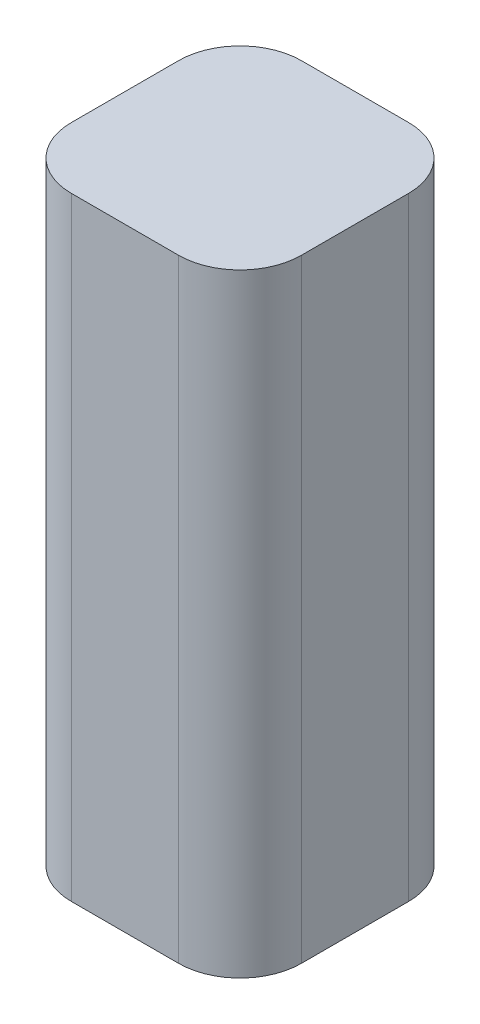
ISO-10303-21;
HEADER;
FILE_DESCRIPTION(('STEP AP214'),'2;1');
FILE_NAME('part.step','',(''),(''),'','','');
FILE_SCHEMA(('AUTOMOTIVE_DESIGN { 1 0 10303 214 1 1 1 1 }'));
ENDSEC;
DATA;
#1=APPLICATION_CONTEXT('core data for automotive mechanical design processes');
#2=APPLICATION_PROTOCOL_DEFINITION('international standard','automotive_design',2000,#1);
#3=PRODUCT_CONTEXT('',#1,'mechanical');
#4=PRODUCT('Part','Part','',(#3));
#5=PRODUCT_RELATED_PRODUCT_CATEGORY('part','',(#4));
#6=PRODUCT_DEFINITION_FORMATION('','',#4);
#7=PRODUCT_DEFINITION_CONTEXT('part definition',#1,'design');
#8=PRODUCT_DEFINITION('design','',#6,#7);
#9=PRODUCT_DEFINITION_SHAPE('','',#8);
#10=(LENGTH_UNIT() NAMED_UNIT(*) SI_UNIT(.MILLI.,.METRE.));
#11=(NAMED_UNIT(*) PLANE_ANGLE_UNIT() SI_UNIT($,.RADIAN.));
#12=(NAMED_UNIT(*) SI_UNIT($,.STERADIAN.) SOLID_ANGLE_UNIT());
#13=UNCERTAINTY_MEASURE_WITH_UNIT(LENGTH_MEASURE(1.E-05),#10,'distance_accuracy_value','');
#14=(GEOMETRIC_REPRESENTATION_CONTEXT(3) GLOBAL_UNCERTAINTY_ASSIGNED_CONTEXT((#13)) GLOBAL_UNIT_ASSIGNED_CONTEXT((#10,
#11,#12)) REPRESENTATION_CONTEXT('',''));
#15=CARTESIAN_POINT('',(0.,0.,0.));
#16=DIRECTION('',(0.,0.,1.));
#17=DIRECTION('',(1.,0.,0.));
#18=AXIS2_PLACEMENT_3D('',#15,#16,#17);
#19=CARTESIAN_POINT('',(-1.75,10.,1.75));
#20=DIRECTION('',(0.,-1.,0.));
#21=DIRECTION('',(0.,0.,-1.));
#22=AXIS2_PLACEMENT_3D('',#19,#20,#21);
#23=CYLINDRICAL_SURFACE('',#22,2.);
#24=CARTESIAN_POINT('',(-1.75,-10.,1.75));
#25=DIRECTION('',(0.,1.,0.));
#26=DIRECTION('',(0.,0.,-1.));
#27=AXIS2_PLACEMENT_3D('',#24,#25,#26);
#28=CIRCLE('',#27,2.);
#29=CARTESIAN_POINT('',(-3.75,-10.,1.75));
#30=VERTEX_POINT('',#29);
#31=CARTESIAN_POINT('',(-1.75,-10.,3.75));
#32=VERTEX_POINT('',#31);
#33=EDGE_CURVE('E146',#30,#32,#28,.T.);
#34=ORIENTED_EDGE('',*,*,#33,.T.);
#35=DIRECTION('',(0.,-1.,0.));
#36=VECTOR('',#35,1.);
#37=CARTESIAN_POINT('',(-1.75,10.,3.75));
#38=LINE('',#37,#36);
#39=CARTESIAN_POINT('',(-1.75,10.,3.75));
#40=VERTEX_POINT('',#39);
#41=EDGE_CURVE('E11',#40,#32,#38,.T.);
#42=ORIENTED_EDGE('',*,*,#41,.F.);
#43=CARTESIAN_POINT('',(-1.75,10.,1.75));
#44=DIRECTION('',(0.,1.,0.));
#45=DIRECTION('',(0.,0.,-1.));
#46=AXIS2_PLACEMENT_3D('',#43,#44,#45);
#47=CIRCLE('',#46,2.);
#48=CARTESIAN_POINT('',(-3.75,10.,1.75));
#49=VERTEX_POINT('',#48);
#50=EDGE_CURVE('E168',#49,#40,#47,.T.);
#51=ORIENTED_EDGE('',*,*,#50,.F.);
#52=DIRECTION('',(0.,-1.,0.));
#53=VECTOR('',#52,1.);
#54=CARTESIAN_POINT('',(-3.75,10.,1.75));
#55=LINE('',#54,#53);
#56=EDGE_CURVE('E142',#49,#30,#55,.T.);
#57=ORIENTED_EDGE('',*,*,#56,.T.);
#58=EDGE_LOOP('',(#34,#42,#51,#57));
#59=FACE_BOUND('',#58,.T.);
#60=ADVANCED_FACE('F45',(#59),#23,.T.);
#61=CARTESIAN_POINT('',(1.75,10.,3.75));
#62=DIRECTION('',(0.,0.,-1.));
#63=DIRECTION('',(-1.,0.,0.));
#64=AXIS2_PLACEMENT_3D('',#61,#62,#63);
#65=PLANE('',#64);
#66=DIRECTION('',(1.,0.,0.));
#67=VECTOR('',#66,1.);
#68=CARTESIAN_POINT('',(1.75,-10.,3.75));
#69=LINE('',#68,#67);
#70=CARTESIAN_POINT('',(1.75,-10.,3.75));
#71=VERTEX_POINT('',#70);
#72=EDGE_CURVE('E150',#32,#71,#69,.T.);
#73=ORIENTED_EDGE('',*,*,#72,.T.);
#74=DIRECTION('',(0.,-1.,0.));
#75=VECTOR('',#74,1.);
#76=CARTESIAN_POINT('',(1.75,10.,3.75));
#77=LINE('',#76,#75);
#78=CARTESIAN_POINT('',(1.75,10.,3.75));
#79=VERTEX_POINT('',#78);
#80=EDGE_CURVE('E54',#79,#71,#77,.T.);
#81=ORIENTED_EDGE('',*,*,#80,.F.);
#82=DIRECTION('',(1.,0.,0.));
#83=VECTOR('',#82,1.);
#84=CARTESIAN_POINT('',(1.75,10.,3.75));
#85=LINE('',#84,#83);
#86=EDGE_CURVE('E105',#40,#79,#85,.T.);
#87=ORIENTED_EDGE('',*,*,#86,.F.);
#88=ORIENTED_EDGE('',*,*,#41,.T.);
#89=EDGE_LOOP('',(#73,#81,#87,#88));
#90=FACE_BOUND('',#89,.T.);
#91=ADVANCED_FACE('F214',(#90),#65,.F.);
#92=CARTESIAN_POINT('',(1.75,10.,1.75));
#93=DIRECTION('',(0.,-1.,0.));
#94=DIRECTION('',(0.,0.,-1.));
#95=AXIS2_PLACEMENT_3D('',#92,#93,#94);
#96=CYLINDRICAL_SURFACE('',#95,2.);
#97=CARTESIAN_POINT('',(1.75,-10.,1.75));
#98=DIRECTION('',(0.,1.,0.));
#99=DIRECTION('',(0.,0.,-1.));
#100=AXIS2_PLACEMENT_3D('',#97,#98,#99);
#101=CIRCLE('',#100,2.);
#102=CARTESIAN_POINT('',(3.75,-10.,1.75));
#103=VERTEX_POINT('',#102);
#104=EDGE_CURVE('E153',#71,#103,#101,.T.);
#105=ORIENTED_EDGE('',*,*,#104,.T.);
#106=DIRECTION('',(0.,-1.,0.));
#107=VECTOR('',#106,1.);
#108=CARTESIAN_POINT('',(3.75,10.,1.75));
#109=LINE('',#108,#107);
#110=CARTESIAN_POINT('',(3.75,10.,1.75));
#111=VERTEX_POINT('',#110);
#112=EDGE_CURVE('E179',#111,#103,#109,.T.);
#113=ORIENTED_EDGE('',*,*,#112,.F.);
#114=CARTESIAN_POINT('',(1.75,10.,1.75));
#115=DIRECTION('',(0.,1.,0.));
#116=DIRECTION('',(0.,0.,-1.));
#117=AXIS2_PLACEMENT_3D('',#114,#115,#116);
#118=CIRCLE('',#117,2.);
#119=EDGE_CURVE('E189',#79,#111,#118,.T.);
#120=ORIENTED_EDGE('',*,*,#119,.F.);
#121=ORIENTED_EDGE('',*,*,#80,.T.);
#122=EDGE_LOOP('',(#105,#113,#120,#121));
#123=FACE_BOUND('',#122,.T.);
#124=ADVANCED_FACE('F187',(#123),#96,.T.);
#125=CARTESIAN_POINT('',(3.75,10.,-1.75));
#126=DIRECTION('',(-1.,0.,0.));
#127=DIRECTION('',(0.,0.,1.));
#128=AXIS2_PLACEMENT_3D('',#125,#126,#127);
#129=PLANE('',#128);
#130=DIRECTION('',(0.,0.,-1.));
#131=VECTOR('',#130,1.);
#132=CARTESIAN_POINT('',(3.75,-10.,-1.75));
#133=LINE('',#132,#131);
#134=CARTESIAN_POINT('',(3.75,-10.,-1.75));
#135=VERTEX_POINT('',#134);
#136=EDGE_CURVE('E156',#103,#135,#133,.T.);
#137=ORIENTED_EDGE('',*,*,#136,.T.);
#138=DIRECTION('',(0.,-1.,0.));
#139=VECTOR('',#138,1.);
#140=CARTESIAN_POINT('',(3.75,10.,-1.75));
#141=LINE('',#140,#139);
#142=CARTESIAN_POINT('',(3.75,10.,-1.75));
#143=VERTEX_POINT('',#142);
#144=EDGE_CURVE('E175',#143,#135,#141,.T.);
#145=ORIENTED_EDGE('',*,*,#144,.F.);
#146=DIRECTION('',(0.,0.,-1.));
#147=VECTOR('',#146,1.);
#148=CARTESIAN_POINT('',(3.75,10.,-1.75));
#149=LINE('',#148,#147);
#150=EDGE_CURVE('E202',#111,#143,#149,.T.);
#151=ORIENTED_EDGE('',*,*,#150,.F.);
#152=ORIENTED_EDGE('',*,*,#112,.T.);
#153=EDGE_LOOP('',(#137,#145,#151,#152));
#154=FACE_BOUND('',#153,.T.);
#155=ADVANCED_FACE('F197',(#154),#129,.F.);
#156=CARTESIAN_POINT('',(1.75,10.,-1.75));
#157=DIRECTION('',(0.,-1.,0.));
#158=DIRECTION('',(0.,0.,-1.));
#159=AXIS2_PLACEMENT_3D('',#156,#157,#158);
#160=CYLINDRICAL_SURFACE('',#159,2.);
#161=CARTESIAN_POINT('',(1.75,-10.,-1.75));
#162=DIRECTION('',(0.,1.,0.));
#163=DIRECTION('',(0.,0.,-1.));
#164=AXIS2_PLACEMENT_3D('',#161,#162,#163);
#165=CIRCLE('',#164,2.);
#166=CARTESIAN_POINT('',(1.75,-10.,-3.75));
#167=VERTEX_POINT('',#166);
#168=EDGE_CURVE('E159',#135,#167,#165,.T.);
#169=ORIENTED_EDGE('',*,*,#168,.T.);
#170=DIRECTION('',(0.,-1.,0.));
#171=VECTOR('',#170,1.);
#172=CARTESIAN_POINT('',(1.75,10.,-3.75));
#173=LINE('',#172,#171);
#174=CARTESIAN_POINT('',(1.75,10.,-3.75));
#175=VERTEX_POINT('',#174);
#176=EDGE_CURVE('E135',#175,#167,#173,.T.);
#177=ORIENTED_EDGE('',*,*,#176,.F.);
#178=CARTESIAN_POINT('',(1.75,10.,-1.75));
#179=DIRECTION('',(0.,1.,0.));
#180=DIRECTION('',(0.,0.,-1.));
#181=AXIS2_PLACEMENT_3D('',#178,#179,#180);
#182=CIRCLE('',#181,2.);
#183=EDGE_CURVE('E124',#143,#175,#182,.T.);
#184=ORIENTED_EDGE('',*,*,#183,.F.);
#185=ORIENTED_EDGE('',*,*,#144,.T.);
#186=EDGE_LOOP('',(#169,#177,#184,#185));
#187=FACE_BOUND('',#186,.T.);
#188=ADVANCED_FACE('F200',(#187),#160,.T.);
#189=CARTESIAN_POINT('',(-1.75,10.,-3.75));
#190=DIRECTION('',(0.,0.,1.));
#191=DIRECTION('',(1.,0.,0.));
#192=AXIS2_PLACEMENT_3D('',#189,#190,#191);
#193=PLANE('',#192);
#194=DIRECTION('',(-1.,0.,0.));
#195=VECTOR('',#194,1.);
#196=CARTESIAN_POINT('',(-1.75,-10.,-3.75));
#197=LINE('',#196,#195);
#198=CARTESIAN_POINT('',(-1.75,-10.,-3.75));
#199=VERTEX_POINT('',#198);
#200=EDGE_CURVE('E133',#167,#199,#197,.T.);
#201=ORIENTED_EDGE('',*,*,#200,.T.);
#202=DIRECTION('',(0.,-1.,0.));
#203=VECTOR('',#202,1.);
#204=CARTESIAN_POINT('',(-1.75,10.,-3.75));
#205=LINE('',#204,#203);
#206=CARTESIAN_POINT('',(-1.75,10.,-3.75));
#207=VERTEX_POINT('',#206);
#208=EDGE_CURVE('E130',#207,#199,#205,.T.);
#209=ORIENTED_EDGE('',*,*,#208,.F.);
#210=DIRECTION('',(-1.,0.,0.));
#211=VECTOR('',#210,1.);
#212=CARTESIAN_POINT('',(-1.75,10.,-3.75));
#213=LINE('',#212,#211);
#214=EDGE_CURVE('E118',#175,#207,#213,.T.);
#215=ORIENTED_EDGE('',*,*,#214,.F.);
#216=ORIENTED_EDGE('',*,*,#176,.T.);
#217=EDGE_LOOP('',(#201,#209,#215,#216));
#218=FACE_BOUND('',#217,.T.);
#219=ADVANCED_FACE('F131',(#218),#193,.F.);
#220=CARTESIAN_POINT('',(-1.75,10.,-1.75));
#221=DIRECTION('',(0.,-1.,0.));
#222=DIRECTION('',(0.,0.,-1.));
#223=AXIS2_PLACEMENT_3D('',#220,#221,#222);
#224=CYLINDRICAL_SURFACE('',#223,2.);
#225=CARTESIAN_POINT('',(-1.75,-10.,-1.75));
#226=DIRECTION('',(0.,1.,0.));
#227=DIRECTION('',(0.,0.,-1.));
#228=AXIS2_PLACEMENT_3D('',#225,#226,#227);
#229=CIRCLE('',#228,2.);
#230=CARTESIAN_POINT('',(-3.75,-10.,-1.75));
#231=VERTEX_POINT('',#230);
#232=EDGE_CURVE('E91',#199,#231,#229,.T.);
#233=ORIENTED_EDGE('',*,*,#232,.T.);
#234=DIRECTION('',(0.,-1.,0.));
#235=VECTOR('',#234,1.);
#236=CARTESIAN_POINT('',(-3.75,10.,-1.75));
#237=LINE('',#236,#235);
#238=CARTESIAN_POINT('',(-3.75,10.,-1.75));
#239=VERTEX_POINT('',#238);
#240=EDGE_CURVE('E136',#239,#231,#237,.T.);
#241=ORIENTED_EDGE('',*,*,#240,.F.);
#242=CARTESIAN_POINT('',(-1.75,10.,-1.75));
#243=DIRECTION('',(0.,1.,0.));
#244=DIRECTION('',(0.,0.,-1.));
#245=AXIS2_PLACEMENT_3D('',#242,#243,#244);
#246=CIRCLE('',#245,2.);
#247=EDGE_CURVE('E122',#207,#239,#246,.T.);
#248=ORIENTED_EDGE('',*,*,#247,.F.);
#249=ORIENTED_EDGE('',*,*,#208,.T.);
#250=EDGE_LOOP('',(#233,#241,#248,#249));
#251=FACE_BOUND('',#250,.T.);
#252=ADVANCED_FACE('F138',(#251),#224,.T.);
#253=CARTESIAN_POINT('',(-3.75,10.,1.75));
#254=DIRECTION('',(1.,0.,0.));
#255=DIRECTION('',(0.,0.,-1.));
#256=AXIS2_PLACEMENT_3D('',#253,#254,#255);
#257=PLANE('',#256);
#258=DIRECTION('',(0.,0.,1.));
#259=VECTOR('',#258,1.);
#260=CARTESIAN_POINT('',(-3.75,-10.,1.75));
#261=LINE('',#260,#259);
#262=EDGE_CURVE('E97',#231,#30,#261,.T.);
#263=ORIENTED_EDGE('',*,*,#262,.T.);
#264=ORIENTED_EDGE('',*,*,#56,.F.);
#265=DIRECTION('',(0.,0.,1.));
#266=VECTOR('',#265,1.);
#267=CARTESIAN_POINT('',(-3.75,10.,1.75));
#268=LINE('',#267,#266);
#269=EDGE_CURVE('E62',#239,#49,#268,.T.);
#270=ORIENTED_EDGE('',*,*,#269,.F.);
#271=ORIENTED_EDGE('',*,*,#240,.T.);
#272=EDGE_LOOP('',(#263,#264,#270,#271));
#273=FACE_BOUND('',#272,.T.);
#274=ADVANCED_FACE('F230',(#273),#257,.F.);
#275=CARTESIAN_POINT('',(-1.75,10.,1.75));
#276=DIRECTION('',(0.,-1.,0.));
#277=DIRECTION('',(0.,0.,-1.));
#278=AXIS2_PLACEMENT_3D('',#275,#276,#277);
#279=PLANE('',#278);
#280=ORIENTED_EDGE('',*,*,#50,.T.);
#281=ORIENTED_EDGE('',*,*,#86,.T.);
#282=ORIENTED_EDGE('',*,*,#119,.T.);
#283=ORIENTED_EDGE('',*,*,#150,.T.);
#284=ORIENTED_EDGE('',*,*,#183,.T.);
#285=ORIENTED_EDGE('',*,*,#214,.T.);
#286=ORIENTED_EDGE('',*,*,#247,.T.);
#287=ORIENTED_EDGE('',*,*,#269,.T.);
#288=EDGE_LOOP('',(#280,#281,#282,#283,#284,#285,#286,#287));
#289=FACE_BOUND('',#288,.T.);
#290=ADVANCED_FACE('F120',(#289),#279,.F.);
#291=CARTESIAN_POINT('',(-1.75,-10.,1.75));
#292=DIRECTION('',(0.,-1.,0.));
#293=DIRECTION('',(0.,0.,-1.));
#294=AXIS2_PLACEMENT_3D('',#291,#292,#293);
#295=PLANE('',#294);
#296=ORIENTED_EDGE('',*,*,#33,.F.);
#297=ORIENTED_EDGE('',*,*,#262,.F.);
#298=ORIENTED_EDGE('',*,*,#232,.F.);
#299=ORIENTED_EDGE('',*,*,#200,.F.);
#300=ORIENTED_EDGE('',*,*,#168,.F.);
#301=ORIENTED_EDGE('',*,*,#136,.F.);
#302=ORIENTED_EDGE('',*,*,#104,.F.);
#303=ORIENTED_EDGE('',*,*,#72,.F.);
#304=EDGE_LOOP('',(#296,#297,#298,#299,#300,#301,#302,#303));
#305=FACE_BOUND('',#304,.T.);
#306=ADVANCED_FACE('F193',(#305),#295,.T.);
#307=CLOSED_SHELL('',(#60,#91,#124,#155,#188,#219,#252,#274,#290,#306));
#308=MANIFOLD_SOLID_BREP('B2',#307);
#309=ADVANCED_BREP_SHAPE_REPRESENTATION('',(#18,#308),#14);
#310=SHAPE_DEFINITION_REPRESENTATION(#9,#309);
ENDSEC;
END-ISO-10303-21;
